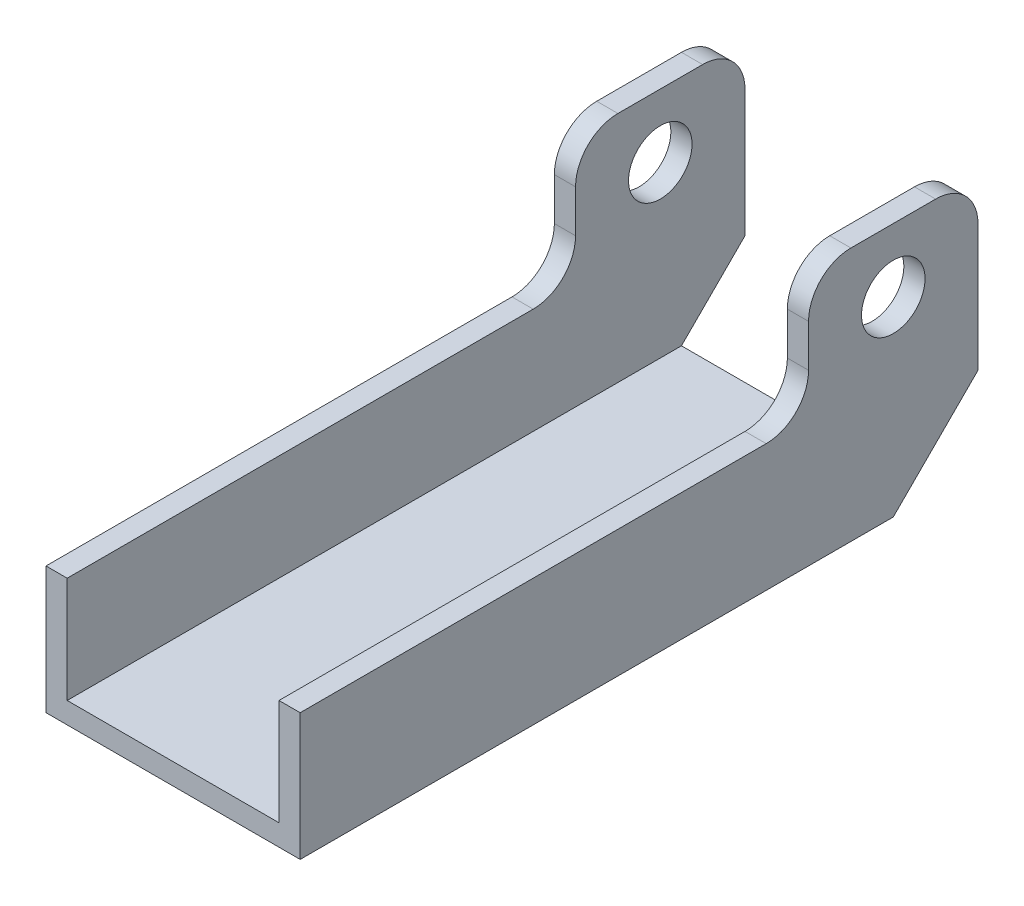
ISO-10303-21;
HEADER;
FILE_DESCRIPTION(('STEP AP214'),'2;1');
FILE_NAME('part.step','',(''),(''),'','','');
FILE_SCHEMA(('AUTOMOTIVE_DESIGN { 1 0 10303 214 1 1 1 1 }'));
ENDSEC;
DATA;
#1=APPLICATION_CONTEXT('core data for automotive mechanical design processes');
#2=APPLICATION_PROTOCOL_DEFINITION('international standard','automotive_design',2000,#1);
#3=PRODUCT_CONTEXT('',#1,'mechanical');
#4=PRODUCT('Part','Part','',(#3));
#5=PRODUCT_RELATED_PRODUCT_CATEGORY('part','',(#4));
#6=PRODUCT_DEFINITION_FORMATION('','',#4);
#7=PRODUCT_DEFINITION_CONTEXT('part definition',#1,'design');
#8=PRODUCT_DEFINITION('design','',#6,#7);
#9=PRODUCT_DEFINITION_SHAPE('','',#8);
#10=(LENGTH_UNIT() NAMED_UNIT(*) SI_UNIT(.MILLI.,.METRE.));
#11=(NAMED_UNIT(*) PLANE_ANGLE_UNIT() SI_UNIT($,.RADIAN.));
#12=(NAMED_UNIT(*) SI_UNIT($,.STERADIAN.) SOLID_ANGLE_UNIT());
#13=UNCERTAINTY_MEASURE_WITH_UNIT(LENGTH_MEASURE(1.E-05),#10,'distance_accuracy_value','');
#14=(GEOMETRIC_REPRESENTATION_CONTEXT(3) GLOBAL_UNCERTAINTY_ASSIGNED_CONTEXT((#13)) GLOBAL_UNIT_ASSIGNED_CONTEXT((#10,
#11,#12)) REPRESENTATION_CONTEXT('',''));
#15=CARTESIAN_POINT('',(0.,0.,0.));
#16=DIRECTION('',(0.,0.,1.));
#17=DIRECTION('',(1.,0.,0.));
#18=AXIS2_PLACEMENT_3D('',#15,#16,#17);
#19=CARTESIAN_POINT('',(0.,0.,0.));
#20=DIRECTION('',(0.,0.,-1.));
#21=DIRECTION('',(-1.,0.,0.));
#22=AXIS2_PLACEMENT_3D('',#19,#20,#21);
#23=PLANE('',#22);
#24=DIRECTION('',(0.,1.,0.));
#25=VECTOR('',#24,1.);
#26=CARTESIAN_POINT('',(19.05,9.525,0.));
#27=LINE('',#26,#25);
#28=CARTESIAN_POINT('',(19.05,6.35000000000005,0.));
#29=VERTEX_POINT('',#28);
#30=CARTESIAN_POINT('',(19.05,15.875,0.));
#31=VERTEX_POINT('',#30);
#32=EDGE_CURVE('E316',#29,#31,#27,.T.);
#33=ORIENTED_EDGE('',*,*,#32,.F.);
#34=DIRECTION('',(-1.,0.,0.));
#35=VECTOR('',#34,1.);
#36=CARTESIAN_POINT('',(0.,6.35000000000004,0.));
#37=LINE('',#36,#35);
#38=CARTESIAN_POINT('',(17.4625,6.35000000000004,0.));
#39=VERTEX_POINT('',#38);
#40=EDGE_CURVE('E276',#29,#39,#37,.T.);
#41=ORIENTED_EDGE('',*,*,#40,.T.);
#42=DIRECTION('',(0.,-1.,0.));
#43=VECTOR('',#42,1.);
#44=CARTESIAN_POINT('',(17.4625,9.525,0.));
#45=LINE('',#44,#43);
#46=CARTESIAN_POINT('',(17.4625,15.875,0.));
#47=VERTEX_POINT('',#46);
#48=EDGE_CURVE('E292',#47,#39,#45,.T.);
#49=ORIENTED_EDGE('',*,*,#48,.F.);
#50=DIRECTION('',(-1.,0.,0.));
#51=VECTOR('',#50,1.);
#52=CARTESIAN_POINT('',(0.,15.875,0.));
#53=LINE('',#52,#51);
#54=EDGE_CURVE('E254',#47,#31,#53,.F.);
#55=ORIENTED_EDGE('',*,*,#54,.T.);
#56=EDGE_LOOP('',(#33,#41,#49,#55));
#57=FACE_BOUND('',#56,.T.);
#58=ADVANCED_FACE('F39',(#57),#23,.T.);
#59=CARTESIAN_POINT('',(19.05,9.525,50.8));
#60=DIRECTION('',(-1.,0.,0.));
#61=DIRECTION('',(0.,0.,1.));
#62=AXIS2_PLACEMENT_3D('',#59,#60,#61);
#63=PLANE('',#62);
#64=DIRECTION('',(0.,0.,-1.));
#65=VECTOR('',#64,1.);
#66=CARTESIAN_POINT('',(19.05,0.,50.8));
#67=LINE('',#66,#65);
#68=CARTESIAN_POINT('',(19.05,0.,50.8));
#69=VERTEX_POINT('',#68);
#70=CARTESIAN_POINT('',(19.05,0.,6.35000000000011));
#71=VERTEX_POINT('',#70);
#72=EDGE_CURVE('E186',#69,#71,#67,.T.);
#73=ORIENTED_EDGE('',*,*,#72,.T.);
#74=DIRECTION('',(0.,0.707106781186544,-0.707106781186551));
#75=VECTOR('',#74,1.);
#76=CARTESIAN_POINT('',(19.05,0.,6.35000000000011));
#77=LINE('',#76,#75);
#78=EDGE_CURVE('E272',#71,#29,#77,.T.);
#79=ORIENTED_EDGE('',*,*,#78,.T.);
#80=ORIENTED_EDGE('',*,*,#32,.T.);
#81=CARTESIAN_POINT('',(19.05,15.875,3.175));
#82=DIRECTION('',(-1.,0.,0.));
#83=DIRECTION('',(0.,0.,1.));
#84=AXIS2_PLACEMENT_3D('',#81,#82,#83);
#85=CIRCLE('',#84,3.175);
#86=CARTESIAN_POINT('',(19.05,19.05,3.175));
#87=VERTEX_POINT('',#86);
#88=EDGE_CURVE('E243',#31,#87,#85,.F.);
#89=ORIENTED_EDGE('',*,*,#88,.T.);
#90=DIRECTION('',(0.,0.,-1.));
#91=VECTOR('',#90,1.);
#92=CARTESIAN_POINT('',(19.05,19.05,0.));
#93=LINE('',#92,#91);
#94=CARTESIAN_POINT('',(19.05,19.05,9.525));
#95=VERTEX_POINT('',#94);
#96=EDGE_CURVE('E354',#95,#87,#93,.T.);
#97=ORIENTED_EDGE('',*,*,#96,.F.);
#98=CARTESIAN_POINT('',(19.05,15.875,9.525));
#99=DIRECTION('',(-1.,0.,0.));
#100=DIRECTION('',(0.,0.,1.));
#101=AXIS2_PLACEMENT_3D('',#98,#99,#100);
#102=CIRCLE('',#101,3.175);
#103=CARTESIAN_POINT('',(19.05,15.875,12.7));
#104=VERTEX_POINT('',#103);
#105=EDGE_CURVE('E245',#95,#104,#102,.F.);
#106=ORIENTED_EDGE('',*,*,#105,.T.);
#107=DIRECTION('',(0.,-1.,0.));
#108=VECTOR('',#107,1.);
#109=CARTESIAN_POINT('',(19.05,19.05,12.7));
#110=LINE('',#109,#108);
#111=CARTESIAN_POINT('',(19.05,12.7,12.7));
#112=VERTEX_POINT('',#111);
#113=EDGE_CURVE('E349',#104,#112,#110,.T.);
#114=ORIENTED_EDGE('',*,*,#113,.T.);
#115=CARTESIAN_POINT('',(19.05,12.7,15.875));
#116=DIRECTION('',(-1.,0.,0.));
#117=DIRECTION('',(0.,0.,1.));
#118=AXIS2_PLACEMENT_3D('',#115,#116,#117);
#119=CIRCLE('',#118,3.175);
#120=CARTESIAN_POINT('',(19.05,9.525,15.875));
#121=VERTEX_POINT('',#120);
#122=EDGE_CURVE('E257',#112,#121,#119,.T.);
#123=ORIENTED_EDGE('',*,*,#122,.T.);
#124=DIRECTION('',(0.,0.,-1.));
#125=VECTOR('',#124,1.);
#126=CARTESIAN_POINT('',(19.05,9.525,50.8));
#127=LINE('',#126,#125);
#128=CARTESIAN_POINT('',(19.05,9.525,50.8));
#129=VERTEX_POINT('',#128);
#130=EDGE_CURVE('E208',#129,#121,#127,.T.);
#131=ORIENTED_EDGE('',*,*,#130,.F.);
#132=DIRECTION('',(0.,1.,0.));
#133=VECTOR('',#132,1.);
#134=CARTESIAN_POINT('',(19.05,9.525,50.8));
#135=LINE('',#134,#133);
#136=EDGE_CURVE('E189',#69,#129,#135,.T.);
#137=ORIENTED_EDGE('',*,*,#136,.F.);
#138=EDGE_LOOP('',(#73,#79,#80,#89,#97,#106,#114,#123,#131,#137));
#139=FACE_BOUND('',#138,.T.);
#140=CARTESIAN_POINT('',(19.05,14.2875,6.35));
#141=DIRECTION('',(1.,0.,0.));
#142=DIRECTION('',(0.,0.,-1.));
#143=AXIS2_PLACEMENT_3D('',#140,#141,#142);
#144=CIRCLE('',#143,2.38125);
#145=CARTESIAN_POINT('',(19.05,14.2875,3.96875));
#146=VERTEX_POINT('',#145);
#147=EDGE_CURVE('E435',#146,#146,#144,.T.);
#148=ORIENTED_EDGE('',*,*,#147,.F.);
#149=EDGE_LOOP('',(#148));
#150=FACE_BOUND('',#149,.T.);
#151=ADVANCED_FACE('F296',(#139,#150),#63,.F.);
#152=CARTESIAN_POINT('',(17.4625,9.525,50.8));
#153=DIRECTION('',(0.,-1.,0.));
#154=DIRECTION('',(0.,0.,-1.));
#155=AXIS2_PLACEMENT_3D('',#152,#153,#154);
#156=PLANE('',#155);
#157=ORIENTED_EDGE('',*,*,#130,.T.);
#158=DIRECTION('',(1.,0.,0.));
#159=VECTOR('',#158,1.);
#160=CARTESIAN_POINT('',(17.4625,9.525,15.875));
#161=LINE('',#160,#159);
#162=CARTESIAN_POINT('',(17.4625,9.525,15.875));
#163=VERTEX_POINT('',#162);
#164=EDGE_CURVE('E214',#121,#163,#161,.F.);
#165=ORIENTED_EDGE('',*,*,#164,.T.);
#166=DIRECTION('',(0.,0.,-1.));
#167=VECTOR('',#166,1.);
#168=CARTESIAN_POINT('',(17.4625,9.525,50.8));
#169=LINE('',#168,#167);
#170=CARTESIAN_POINT('',(17.4625,9.525,50.8));
#171=VERTEX_POINT('',#170);
#172=EDGE_CURVE('E327',#171,#163,#169,.T.);
#173=ORIENTED_EDGE('',*,*,#172,.F.);
#174=DIRECTION('',(-1.,0.,0.));
#175=VECTOR('',#174,1.);
#176=CARTESIAN_POINT('',(17.4625,9.525,50.8));
#177=LINE('',#176,#175);
#178=EDGE_CURVE('E302',#129,#171,#177,.T.);
#179=ORIENTED_EDGE('',*,*,#178,.F.);
#180=EDGE_LOOP('',(#157,#165,#173,#179));
#181=FACE_BOUND('',#180,.T.);
#182=ADVANCED_FACE('F331',(#181),#156,.F.);
#183=CARTESIAN_POINT('',(0.,9.525,50.8));
#184=DIRECTION('',(0.,-1.,0.));
#185=DIRECTION('',(0.,0.,-1.));
#186=AXIS2_PLACEMENT_3D('',#183,#184,#185);
#187=PLANE('',#186);
#188=DIRECTION('',(0.,0.,-1.));
#189=VECTOR('',#188,1.);
#190=CARTESIAN_POINT('',(1.5875,9.525,50.8));
#191=LINE('',#190,#189);
#192=CARTESIAN_POINT('',(1.5875,9.525,50.8));
#193=VERTEX_POINT('',#192);
#194=CARTESIAN_POINT('',(1.5875,9.525,15.875));
#195=VERTEX_POINT('',#194);
#196=EDGE_CURVE('E321',#193,#195,#191,.T.);
#197=ORIENTED_EDGE('',*,*,#196,.T.);
#198=DIRECTION('',(1.,0.,0.));
#199=VECTOR('',#198,1.);
#200=CARTESIAN_POINT('',(0.,9.525,15.875));
#201=LINE('',#200,#199);
#202=CARTESIAN_POINT('',(0.,9.525,15.875));
#203=VERTEX_POINT('',#202);
#204=EDGE_CURVE('E221',#195,#203,#201,.F.);
#205=ORIENTED_EDGE('',*,*,#204,.T.);
#206=DIRECTION('',(0.,0.,-1.));
#207=VECTOR('',#206,1.);
#208=CARTESIAN_POINT('',(0.,9.525,50.8));
#209=LINE('',#208,#207);
#210=CARTESIAN_POINT('',(0.,9.525,50.8));
#211=VERTEX_POINT('',#210);
#212=EDGE_CURVE('E313',#211,#203,#209,.T.);
#213=ORIENTED_EDGE('',*,*,#212,.F.);
#214=DIRECTION('',(-1.,0.,0.));
#215=VECTOR('',#214,1.);
#216=CARTESIAN_POINT('',(0.,9.525,50.8));
#217=LINE('',#216,#215);
#218=EDGE_CURVE('E195',#193,#211,#217,.T.);
#219=ORIENTED_EDGE('',*,*,#218,.F.);
#220=EDGE_LOOP('',(#197,#205,#213,#219));
#221=FACE_BOUND('',#220,.T.);
#222=ADVANCED_FACE('F377',(#221),#187,.F.);
#223=CARTESIAN_POINT('',(0.,0.,50.8));
#224=DIRECTION('',(1.,0.,0.));
#225=DIRECTION('',(0.,0.,-1.));
#226=AXIS2_PLACEMENT_3D('',#223,#224,#225);
#227=PLANE('',#226);
#228=CARTESIAN_POINT('',(0.,14.2875,6.35));
#229=DIRECTION('',(1.,0.,0.));
#230=DIRECTION('',(0.,0.,-1.));
#231=AXIS2_PLACEMENT_3D('',#228,#229,#230);
#232=CIRCLE('',#231,2.38124999999999);
#233=CARTESIAN_POINT('',(0.,14.2875,3.96875000000001));
#234=VERTEX_POINT('',#233);
#235=EDGE_CURVE('E270',#234,#234,#232,.T.);
#236=ORIENTED_EDGE('',*,*,#235,.T.);
#237=EDGE_LOOP('',(#236));
#238=FACE_BOUND('',#237,.T.);
#239=DIRECTION('',(0.,-1.,0.));
#240=VECTOR('',#239,1.);
#241=CARTESIAN_POINT('',(0.,0.,0.));
#242=LINE('',#241,#240);
#243=CARTESIAN_POINT('',(0.,15.875,0.));
#244=VERTEX_POINT('',#243);
#245=CARTESIAN_POINT('',(0.,6.35000000000004,0.));
#246=VERTEX_POINT('',#245);
#247=EDGE_CURVE('E314',#244,#246,#242,.T.);
#248=ORIENTED_EDGE('',*,*,#247,.T.);
#249=DIRECTION('',(0.,-0.707106781186544,0.707106781186551));
#250=VECTOR('',#249,1.);
#251=CARTESIAN_POINT('',(0.,0.,6.35000000000011));
#252=LINE('',#251,#250);
#253=CARTESIAN_POINT('',(0.,0.,6.35000000000011));
#254=VERTEX_POINT('',#253);
#255=EDGE_CURVE('E11',#246,#254,#252,.T.);
#256=ORIENTED_EDGE('',*,*,#255,.T.);
#257=DIRECTION('',(0.,0.,-1.));
#258=VECTOR('',#257,1.);
#259=CARTESIAN_POINT('',(0.,0.,50.8));
#260=LINE('',#259,#258);
#261=CARTESIAN_POINT('',(0.,0.,50.8));
#262=VERTEX_POINT('',#261);
#263=EDGE_CURVE('E183',#262,#254,#260,.T.);
#264=ORIENTED_EDGE('',*,*,#263,.F.);
#265=DIRECTION('',(0.,-1.,0.));
#266=VECTOR('',#265,1.);
#267=CARTESIAN_POINT('',(0.,0.,50.8));
#268=LINE('',#267,#266);
#269=EDGE_CURVE('E190',#211,#262,#268,.T.);
#270=ORIENTED_EDGE('',*,*,#269,.F.);
#271=ORIENTED_EDGE('',*,*,#212,.T.);
#272=CARTESIAN_POINT('',(0.,12.7,15.875));
#273=DIRECTION('',(1.,0.,0.));
#274=DIRECTION('',(0.,0.,-1.));
#275=AXIS2_PLACEMENT_3D('',#272,#273,#274);
#276=CIRCLE('',#275,3.175);
#277=CARTESIAN_POINT('',(0.,12.7,12.7));
#278=VERTEX_POINT('',#277);
#279=EDGE_CURVE('E263',#203,#278,#276,.T.);
#280=ORIENTED_EDGE('',*,*,#279,.T.);
#281=DIRECTION('',(0.,-1.,0.));
#282=VECTOR('',#281,1.);
#283=CARTESIAN_POINT('',(0.,19.05,12.7));
#284=LINE('',#283,#282);
#285=CARTESIAN_POINT('',(0.,15.875,12.7));
#286=VERTEX_POINT('',#285);
#287=EDGE_CURVE('E317',#286,#278,#284,.T.);
#288=ORIENTED_EDGE('',*,*,#287,.F.);
#289=CARTESIAN_POINT('',(0.,15.875,9.525));
#290=DIRECTION('',(1.,0.,0.));
#291=DIRECTION('',(0.,0.,-1.));
#292=AXIS2_PLACEMENT_3D('',#289,#290,#291);
#293=CIRCLE('',#292,3.175);
#294=CARTESIAN_POINT('',(0.,19.05,9.525));
#295=VERTEX_POINT('',#294);
#296=EDGE_CURVE('E235',#286,#295,#293,.F.);
#297=ORIENTED_EDGE('',*,*,#296,.T.);
#298=DIRECTION('',(0.,0.,1.));
#299=VECTOR('',#298,1.);
#300=CARTESIAN_POINT('',(0.,19.05,0.));
#301=LINE('',#300,#299);
#302=CARTESIAN_POINT('',(0.,19.05,3.175));
#303=VERTEX_POINT('',#302);
#304=EDGE_CURVE('E348',#303,#295,#301,.T.);
#305=ORIENTED_EDGE('',*,*,#304,.F.);
#306=CARTESIAN_POINT('',(0.,15.875,3.175));
#307=DIRECTION('',(1.,0.,0.));
#308=DIRECTION('',(0.,0.,-1.));
#309=AXIS2_PLACEMENT_3D('',#306,#307,#308);
#310=CIRCLE('',#309,3.175);
#311=EDGE_CURVE('E233',#303,#244,#310,.F.);
#312=ORIENTED_EDGE('',*,*,#311,.T.);
#313=EDGE_LOOP('',(#248,#256,#264,#270,#271,#280,#288,#297,#305,#312));
#314=FACE_BOUND('',#313,.T.);
#315=ADVANCED_FACE('F202',(#238,#314),#227,.F.);
#316=CARTESIAN_POINT('',(0.,0.,50.8));
#317=DIRECTION('',(0.,1.,0.));
#318=DIRECTION('',(-1.,0.,0.));
#319=AXIS2_PLACEMENT_3D('',#316,#317,#318);
#320=PLANE('',#319);
#321=ORIENTED_EDGE('',*,*,#263,.T.);
#322=DIRECTION('',(1.,0.,0.));
#323=VECTOR('',#322,1.);
#324=CARTESIAN_POINT('',(19.05,0.,6.35000000000011));
#325=LINE('',#324,#323);
#326=EDGE_CURVE('E265',#254,#71,#325,.T.);
#327=ORIENTED_EDGE('',*,*,#326,.T.);
#328=ORIENTED_EDGE('',*,*,#72,.F.);
#329=DIRECTION('',(1.,0.,0.));
#330=VECTOR('',#329,1.);
#331=CARTESIAN_POINT('',(0.,0.,50.8));
#332=LINE('',#331,#330);
#333=EDGE_CURVE('E178',#262,#69,#332,.T.);
#334=ORIENTED_EDGE('',*,*,#333,.F.);
#335=EDGE_LOOP('',(#321,#327,#328,#334));
#336=FACE_BOUND('',#335,.T.);
#337=ADVANCED_FACE('F180',(#336),#320,.F.);
#338=CARTESIAN_POINT('',(17.4625,9.525,50.8));
#339=DIRECTION('',(1.,0.,0.));
#340=DIRECTION('',(0.,0.,-1.));
#341=AXIS2_PLACEMENT_3D('',#338,#339,#340);
#342=PLANE('',#341);
#343=CARTESIAN_POINT('',(17.4625,14.2875,6.35));
#344=DIRECTION('',(1.,0.,0.));
#345=DIRECTION('',(0.,0.,-1.));
#346=AXIS2_PLACEMENT_3D('',#343,#344,#345);
#347=CIRCLE('',#346,2.38125);
#348=CARTESIAN_POINT('',(17.4625,14.2875,3.96875));
#349=VERTEX_POINT('',#348);
#350=EDGE_CURVE('E269',#349,#349,#347,.T.);
#351=ORIENTED_EDGE('',*,*,#350,.T.);
#352=EDGE_LOOP('',(#351));
#353=FACE_BOUND('',#352,.T.);
#354=ORIENTED_EDGE('',*,*,#48,.T.);
#355=DIRECTION('',(0.,-0.707106781186544,0.707106781186551));
#356=VECTOR('',#355,1.);
#357=CARTESIAN_POINT('',(17.4625,0.,6.35000000000011));
#358=LINE('',#357,#356);
#359=CARTESIAN_POINT('',(17.4625,1.5875,4.76250000000009));
#360=VERTEX_POINT('',#359);
#361=EDGE_CURVE('E62',#39,#360,#358,.T.);
#362=ORIENTED_EDGE('',*,*,#361,.T.);
#363=DIRECTION('',(0.,0.,-1.));
#364=VECTOR('',#363,1.);
#365=CARTESIAN_POINT('',(17.4625,1.5875,50.8));
#366=LINE('',#365,#364);
#367=CARTESIAN_POINT('',(17.4625,1.5875,50.8));
#368=VERTEX_POINT('',#367);
#369=EDGE_CURVE('E325',#368,#360,#366,.T.);
#370=ORIENTED_EDGE('',*,*,#369,.F.);
#371=DIRECTION('',(0.,-1.,0.));
#372=VECTOR('',#371,1.);
#373=CARTESIAN_POINT('',(17.4625,9.525,50.8));
#374=LINE('',#373,#372);
#375=EDGE_CURVE('E304',#171,#368,#374,.T.);
#376=ORIENTED_EDGE('',*,*,#375,.F.);
#377=ORIENTED_EDGE('',*,*,#172,.T.);
#378=CARTESIAN_POINT('',(17.4625,12.7,15.875));
#379=DIRECTION('',(1.,0.,0.));
#380=DIRECTION('',(0.,0.,-1.));
#381=AXIS2_PLACEMENT_3D('',#378,#379,#380);
#382=CIRCLE('',#381,3.175);
#383=CARTESIAN_POINT('',(17.4625,12.7,12.7));
#384=VERTEX_POINT('',#383);
#385=EDGE_CURVE('E259',#163,#384,#382,.T.);
#386=ORIENTED_EDGE('',*,*,#385,.T.);
#387=DIRECTION('',(0.,-1.,0.));
#388=VECTOR('',#387,1.);
#389=CARTESIAN_POINT('',(17.4625,19.05,12.7));
#390=LINE('',#389,#388);
#391=CARTESIAN_POINT('',(17.4625,15.875,12.7));
#392=VERTEX_POINT('',#391);
#393=EDGE_CURVE('E340',#392,#384,#390,.T.);
#394=ORIENTED_EDGE('',*,*,#393,.F.);
#395=CARTESIAN_POINT('',(17.4625,15.875,9.525));
#396=DIRECTION('',(1.,0.,0.));
#397=DIRECTION('',(0.,0.,-1.));
#398=AXIS2_PLACEMENT_3D('',#395,#396,#397);
#399=CIRCLE('',#398,3.175);
#400=CARTESIAN_POINT('',(17.4625,19.05,9.525));
#401=VERTEX_POINT('',#400);
#402=EDGE_CURVE('E249',#392,#401,#399,.F.);
#403=ORIENTED_EDGE('',*,*,#402,.T.);
#404=DIRECTION('',(0.,0.,1.));
#405=VECTOR('',#404,1.);
#406=CARTESIAN_POINT('',(17.4625,19.05,0.));
#407=LINE('',#406,#405);
#408=CARTESIAN_POINT('',(17.4625,19.05,3.175));
#409=VERTEX_POINT('',#408);
#410=EDGE_CURVE('E439',#409,#401,#407,.T.);
#411=ORIENTED_EDGE('',*,*,#410,.F.);
#412=CARTESIAN_POINT('',(17.4625,15.875,3.175));
#413=DIRECTION('',(1.,0.,0.));
#414=DIRECTION('',(0.,0.,-1.));
#415=AXIS2_PLACEMENT_3D('',#412,#413,#414);
#416=CIRCLE('',#415,3.175);
#417=EDGE_CURVE('E247',#409,#47,#416,.F.);
#418=ORIENTED_EDGE('',*,*,#417,.T.);
#419=EDGE_LOOP('',(#354,#362,#370,#376,#377,#386,#394,#403,#411,#418));
#420=FACE_BOUND('',#419,.T.);
#421=ADVANCED_FACE('F339',(#353,#420),#342,.F.);
#422=CARTESIAN_POINT('',(17.4625,1.5875,50.8));
#423=DIRECTION('',(0.,-1.,0.));
#424=DIRECTION('',(1.,0.,0.));
#425=AXIS2_PLACEMENT_3D('',#422,#423,#424);
#426=PLANE('',#425);
#427=ORIENTED_EDGE('',*,*,#369,.T.);
#428=DIRECTION('',(-1.,0.,0.));
#429=VECTOR('',#428,1.);
#430=CARTESIAN_POINT('',(0.,1.5875,4.7625000000001));
#431=LINE('',#430,#429);
#432=CARTESIAN_POINT('',(1.5875,1.5875,4.7625000000001));
#433=VERTEX_POINT('',#432);
#434=EDGE_CURVE('E54',#360,#433,#431,.T.);
#435=ORIENTED_EDGE('',*,*,#434,.T.);
#436=DIRECTION('',(0.,0.,-1.));
#437=VECTOR('',#436,1.);
#438=CARTESIAN_POINT('',(1.5875,1.5875,50.8));
#439=LINE('',#438,#437);
#440=CARTESIAN_POINT('',(1.5875,1.5875,50.8));
#441=VERTEX_POINT('',#440);
#442=EDGE_CURVE('E284',#441,#433,#439,.T.);
#443=ORIENTED_EDGE('',*,*,#442,.F.);
#444=DIRECTION('',(-1.,0.,0.));
#445=VECTOR('',#444,1.);
#446=CARTESIAN_POINT('',(17.4625,1.5875,50.8));
#447=LINE('',#446,#445);
#448=EDGE_CURVE('E308',#368,#441,#447,.T.);
#449=ORIENTED_EDGE('',*,*,#448,.F.);
#450=EDGE_LOOP('',(#427,#435,#443,#449));
#451=FACE_BOUND('',#450,.T.);
#452=ADVANCED_FACE('F410',(#451),#426,.F.);
#453=CARTESIAN_POINT('',(1.5875,1.5875,50.8));
#454=DIRECTION('',(-1.,0.,0.));
#455=DIRECTION('',(0.,-1.,0.));
#456=AXIS2_PLACEMENT_3D('',#453,#454,#455);
#457=PLANE('',#456);
#458=CARTESIAN_POINT('',(1.5875,14.2875,6.35));
#459=DIRECTION('',(-1.,0.,0.));
#460=DIRECTION('',(0.,-1.,0.));
#461=AXIS2_PLACEMENT_3D('',#458,#459,#460);
#462=CIRCLE('',#461,2.38125);
#463=CARTESIAN_POINT('',(1.5875,11.90625,6.35));
#464=VERTEX_POINT('',#463);
#465=EDGE_CURVE('E266',#464,#464,#462,.T.);
#466=ORIENTED_EDGE('',*,*,#465,.T.);
#467=EDGE_LOOP('',(#466));
#468=FACE_BOUND('',#467,.T.);
#469=ORIENTED_EDGE('',*,*,#442,.T.);
#470=DIRECTION('',(0.,0.707106781186544,-0.707106781186551));
#471=VECTOR('',#470,1.);
#472=CARTESIAN_POINT('',(1.5875,0.,6.35000000000011));
#473=LINE('',#472,#471);
#474=CARTESIAN_POINT('',(1.5875,6.35000000000004,0.));
#475=VERTEX_POINT('',#474);
#476=EDGE_CURVE('E47',#433,#475,#473,.T.);
#477=ORIENTED_EDGE('',*,*,#476,.T.);
#478=DIRECTION('',(0.,1.,0.));
#479=VECTOR('',#478,1.);
#480=CARTESIAN_POINT('',(1.5875,1.5875,0.));
#481=LINE('',#480,#479);
#482=CARTESIAN_POINT('',(1.5875,15.875,0.));
#483=VERTEX_POINT('',#482);
#484=EDGE_CURVE('E199',#475,#483,#481,.T.);
#485=ORIENTED_EDGE('',*,*,#484,.T.);
#486=CARTESIAN_POINT('',(1.5875,15.875,3.175));
#487=DIRECTION('',(-1.,0.,0.));
#488=DIRECTION('',(0.,-1.,0.));
#489=AXIS2_PLACEMENT_3D('',#486,#487,#488);
#490=CIRCLE('',#489,3.175);
#491=CARTESIAN_POINT('',(1.5875,19.05,3.175));
#492=VERTEX_POINT('',#491);
#493=EDGE_CURVE('E229',#483,#492,#490,.F.);
#494=ORIENTED_EDGE('',*,*,#493,.T.);
#495=DIRECTION('',(0.,0.,-1.));
#496=VECTOR('',#495,1.);
#497=CARTESIAN_POINT('',(1.5875,19.05,0.));
#498=LINE('',#497,#496);
#499=CARTESIAN_POINT('',(1.5875,19.05,9.525));
#500=VERTEX_POINT('',#499);
#501=EDGE_CURVE('E352',#500,#492,#498,.T.);
#502=ORIENTED_EDGE('',*,*,#501,.F.);
#503=CARTESIAN_POINT('',(1.5875,15.875,9.525));
#504=DIRECTION('',(-1.,0.,0.));
#505=DIRECTION('',(0.,-1.,0.));
#506=AXIS2_PLACEMENT_3D('',#503,#504,#505);
#507=CIRCLE('',#506,3.175);
#508=CARTESIAN_POINT('',(1.5875,15.875,12.7));
#509=VERTEX_POINT('',#508);
#510=EDGE_CURVE('E231',#500,#509,#507,.F.);
#511=ORIENTED_EDGE('',*,*,#510,.T.);
#512=DIRECTION('',(0.,-1.,0.));
#513=VECTOR('',#512,1.);
#514=CARTESIAN_POINT('',(1.5875,19.05,12.7));
#515=LINE('',#514,#513);
#516=CARTESIAN_POINT('',(1.5875,12.7,12.7));
#517=VERTEX_POINT('',#516);
#518=EDGE_CURVE('E360',#509,#517,#515,.T.);
#519=ORIENTED_EDGE('',*,*,#518,.T.);
#520=CARTESIAN_POINT('',(1.5875,12.7,15.875));
#521=DIRECTION('',(-1.,0.,0.));
#522=DIRECTION('',(0.,-1.,0.));
#523=AXIS2_PLACEMENT_3D('',#520,#521,#522);
#524=CIRCLE('',#523,3.175);
#525=EDGE_CURVE('E261',#517,#195,#524,.T.);
#526=ORIENTED_EDGE('',*,*,#525,.T.);
#527=ORIENTED_EDGE('',*,*,#196,.F.);
#528=DIRECTION('',(0.,1.,0.));
#529=VECTOR('',#528,1.);
#530=CARTESIAN_POINT('',(1.5875,1.5875,50.8));
#531=LINE('',#530,#529);
#532=EDGE_CURVE('E310',#441,#193,#531,.T.);
#533=ORIENTED_EDGE('',*,*,#532,.F.);
#534=EDGE_LOOP('',(#469,#477,#485,#494,#502,#511,#519,#526,#527,#533));
#535=FACE_BOUND('',#534,.T.);
#536=ADVANCED_FACE('F282',(#468,#535),#457,.F.);
#537=CARTESIAN_POINT('',(0.,0.,50.8));
#538=DIRECTION('',(0.,0.,-1.));
#539=DIRECTION('',(-1.,0.,0.));
#540=AXIS2_PLACEMENT_3D('',#537,#538,#539);
#541=PLANE('',#540);
#542=ORIENTED_EDGE('',*,*,#269,.T.);
#543=ORIENTED_EDGE('',*,*,#333,.T.);
#544=ORIENTED_EDGE('',*,*,#136,.T.);
#545=ORIENTED_EDGE('',*,*,#178,.T.);
#546=ORIENTED_EDGE('',*,*,#375,.T.);
#547=ORIENTED_EDGE('',*,*,#448,.T.);
#548=ORIENTED_EDGE('',*,*,#532,.T.);
#549=ORIENTED_EDGE('',*,*,#218,.T.);
#550=EDGE_LOOP('',(#542,#543,#544,#545,#546,#547,#548,#549));
#551=FACE_BOUND('',#550,.T.);
#552=ADVANCED_FACE('F193',(#551),#541,.F.);
#553=ORIENTED_EDGE('',*,*,#484,.F.);
#554=DIRECTION('',(-1.,0.,0.));
#555=VECTOR('',#554,1.);
#556=CARTESIAN_POINT('',(0.,6.35000000000004,0.));
#557=LINE('',#556,#555);
#558=EDGE_CURVE('E274',#475,#246,#557,.T.);
#559=ORIENTED_EDGE('',*,*,#558,.T.);
#560=ORIENTED_EDGE('',*,*,#247,.F.);
#561=DIRECTION('',(-1.,0.,0.));
#562=VECTOR('',#561,1.);
#563=CARTESIAN_POINT('',(0.,15.875,0.));
#564=LINE('',#563,#562);
#565=EDGE_CURVE('E251',#244,#483,#564,.F.);
#566=ORIENTED_EDGE('',*,*,#565,.T.);
#567=EDGE_LOOP('',(#553,#559,#560,#566));
#568=FACE_BOUND('',#567,.T.);
#569=ADVANCED_FACE('F288',(#568),#23,.T.);
#570=CARTESIAN_POINT('',(0.,19.05,12.7));
#571=DIRECTION('',(0.,0.,-1.));
#572=DIRECTION('',(-1.,0.,0.));
#573=AXIS2_PLACEMENT_3D('',#570,#571,#572);
#574=PLANE('',#573);
#575=ORIENTED_EDGE('',*,*,#287,.T.);
#576=DIRECTION('',(1.,0.,0.));
#577=VECTOR('',#576,1.);
#578=CARTESIAN_POINT('',(1.5875,12.7,12.7));
#579=LINE('',#578,#577);
#580=EDGE_CURVE('E218',#278,#517,#579,.T.);
#581=ORIENTED_EDGE('',*,*,#580,.T.);
#582=ORIENTED_EDGE('',*,*,#518,.F.);
#583=DIRECTION('',(1.,0.,0.));
#584=VECTOR('',#583,1.);
#585=CARTESIAN_POINT('',(0.,15.875,12.7));
#586=LINE('',#585,#584);
#587=EDGE_CURVE('E216',#509,#286,#586,.F.);
#588=ORIENTED_EDGE('',*,*,#587,.T.);
#589=EDGE_LOOP('',(#575,#581,#582,#588));
#590=FACE_BOUND('',#589,.T.);
#591=ADVANCED_FACE('F367',(#590),#574,.F.);
#592=CARTESIAN_POINT('',(0.,19.05,0.));
#593=DIRECTION('',(0.,1.,0.));
#594=DIRECTION('',(0.,0.,1.));
#595=AXIS2_PLACEMENT_3D('',#592,#593,#594);
#596=PLANE('',#595);
#597=ORIENTED_EDGE('',*,*,#304,.T.);
#598=DIRECTION('',(1.,0.,0.));
#599=VECTOR('',#598,1.);
#600=CARTESIAN_POINT('',(1.58750000000001,19.05,9.525));
#601=LINE('',#600,#599);
#602=EDGE_CURVE('E226',#295,#500,#601,.T.);
#603=ORIENTED_EDGE('',*,*,#602,.T.);
#604=ORIENTED_EDGE('',*,*,#501,.T.);
#605=DIRECTION('',(-1.,0.,0.));
#606=VECTOR('',#605,1.);
#607=CARTESIAN_POINT('',(0.,19.05,3.175));
#608=LINE('',#607,#606);
#609=EDGE_CURVE('E223',#492,#303,#608,.T.);
#610=ORIENTED_EDGE('',*,*,#609,.T.);
#611=EDGE_LOOP('',(#597,#603,#604,#610));
#612=FACE_BOUND('',#611,.T.);
#613=ADVANCED_FACE('F404',(#612),#596,.T.);
#614=CARTESIAN_POINT('',(17.4625,19.05,12.7));
#615=DIRECTION('',(0.,0.,-1.));
#616=DIRECTION('',(-1.,0.,0.));
#617=AXIS2_PLACEMENT_3D('',#614,#615,#616);
#618=PLANE('',#617);
#619=ORIENTED_EDGE('',*,*,#393,.T.);
#620=DIRECTION('',(1.,0.,0.));
#621=VECTOR('',#620,1.);
#622=CARTESIAN_POINT('',(19.05,12.7,12.7));
#623=LINE('',#622,#621);
#624=EDGE_CURVE('E206',#384,#112,#623,.T.);
#625=ORIENTED_EDGE('',*,*,#624,.T.);
#626=ORIENTED_EDGE('',*,*,#113,.F.);
#627=DIRECTION('',(1.,0.,0.));
#628=VECTOR('',#627,1.);
#629=CARTESIAN_POINT('',(17.4625,15.875,12.7));
#630=LINE('',#629,#628);
#631=EDGE_CURVE('E204',#104,#392,#630,.F.);
#632=ORIENTED_EDGE('',*,*,#631,.T.);
#633=EDGE_LOOP('',(#619,#625,#626,#632));
#634=FACE_BOUND('',#633,.T.);
#635=ADVANCED_FACE('F344',(#634),#618,.F.);
#636=CARTESIAN_POINT('',(0.,19.05,0.));
#637=DIRECTION('',(0.,1.,0.));
#638=DIRECTION('',(0.,0.,1.));
#639=AXIS2_PLACEMENT_3D('',#636,#637,#638);
#640=PLANE('',#639);
#641=ORIENTED_EDGE('',*,*,#410,.T.);
#642=DIRECTION('',(1.,0.,0.));
#643=VECTOR('',#642,1.);
#644=CARTESIAN_POINT('',(19.05,19.05,9.525));
#645=LINE('',#644,#643);
#646=EDGE_CURVE('E240',#401,#95,#645,.T.);
#647=ORIENTED_EDGE('',*,*,#646,.T.);
#648=ORIENTED_EDGE('',*,*,#96,.T.);
#649=DIRECTION('',(-1.,0.,0.));
#650=VECTOR('',#649,1.);
#651=CARTESIAN_POINT('',(0.,19.05,3.175));
#652=LINE('',#651,#650);
#653=EDGE_CURVE('E237',#87,#409,#652,.T.);
#654=ORIENTED_EDGE('',*,*,#653,.T.);
#655=EDGE_LOOP('',(#641,#647,#648,#654));
#656=FACE_BOUND('',#655,.T.);
#657=ADVANCED_FACE('F418',(#656),#640,.T.);
#658=CARTESIAN_POINT('',(17.4625,12.7,15.875));
#659=DIRECTION('',(-1.,0.,0.));
#660=DIRECTION('',(0.,0.,1.));
#661=AXIS2_PLACEMENT_3D('',#658,#659,#660);
#662=CYLINDRICAL_SURFACE('',#661,3.175);
#663=ORIENTED_EDGE('',*,*,#385,.F.);
#664=ORIENTED_EDGE('',*,*,#164,.F.);
#665=ORIENTED_EDGE('',*,*,#122,.F.);
#666=ORIENTED_EDGE('',*,*,#624,.F.);
#667=EDGE_LOOP('',(#663,#664,#665,#666));
#668=FACE_BOUND('',#667,.T.);
#669=ADVANCED_FACE('F335',(#668),#662,.F.);
#670=CARTESIAN_POINT('',(0.,12.7,15.875));
#671=DIRECTION('',(-1.,0.,0.));
#672=DIRECTION('',(0.,0.,1.));
#673=AXIS2_PLACEMENT_3D('',#670,#671,#672);
#674=CYLINDRICAL_SURFACE('',#673,3.175);
#675=ORIENTED_EDGE('',*,*,#279,.F.);
#676=ORIENTED_EDGE('',*,*,#204,.F.);
#677=ORIENTED_EDGE('',*,*,#525,.F.);
#678=ORIENTED_EDGE('',*,*,#580,.F.);
#679=EDGE_LOOP('',(#675,#676,#677,#678));
#680=FACE_BOUND('',#679,.T.);
#681=ADVANCED_FACE('F373',(#680),#674,.F.);
#682=CARTESIAN_POINT('',(0.,15.875,9.525));
#683=DIRECTION('',(-1.,0.,0.));
#684=DIRECTION('',(0.,0.,1.));
#685=AXIS2_PLACEMENT_3D('',#682,#683,#684);
#686=CYLINDRICAL_SURFACE('',#685,3.175);
#687=ORIENTED_EDGE('',*,*,#296,.F.);
#688=ORIENTED_EDGE('',*,*,#587,.F.);
#689=ORIENTED_EDGE('',*,*,#510,.F.);
#690=ORIENTED_EDGE('',*,*,#602,.F.);
#691=EDGE_LOOP('',(#687,#688,#689,#690));
#692=FACE_BOUND('',#691,.T.);
#693=ADVANCED_FACE('F458',(#692),#686,.T.);
#694=CARTESIAN_POINT('',(0.,15.875,9.52499999999996));
#695=DIRECTION('',(-1.,0.,0.));
#696=DIRECTION('',(0.,0.,1.));
#697=AXIS2_PLACEMENT_3D('',#694,#695,#696);
#698=CYLINDRICAL_SURFACE('',#697,3.175);
#699=ORIENTED_EDGE('',*,*,#402,.F.);
#700=ORIENTED_EDGE('',*,*,#631,.F.);
#701=ORIENTED_EDGE('',*,*,#105,.F.);
#702=ORIENTED_EDGE('',*,*,#646,.F.);
#703=EDGE_LOOP('',(#699,#700,#701,#702));
#704=FACE_BOUND('',#703,.T.);
#705=ADVANCED_FACE('F456',(#704),#698,.T.);
#706=CARTESIAN_POINT('',(0.,15.875,3.175));
#707=DIRECTION('',(-1.,0.,0.));
#708=DIRECTION('',(0.,0.,1.));
#709=AXIS2_PLACEMENT_3D('',#706,#707,#708);
#710=CYLINDRICAL_SURFACE('',#709,3.175);
#711=ORIENTED_EDGE('',*,*,#88,.F.);
#712=ORIENTED_EDGE('',*,*,#54,.F.);
#713=ORIENTED_EDGE('',*,*,#417,.F.);
#714=ORIENTED_EDGE('',*,*,#653,.F.);
#715=EDGE_LOOP('',(#711,#712,#713,#714));
#716=FACE_BOUND('',#715,.T.);
#717=ADVANCED_FACE('F452',(#716),#710,.T.);
#718=CARTESIAN_POINT('',(0.,15.875,3.175));
#719=DIRECTION('',(-1.,0.,0.));
#720=DIRECTION('',(0.,0.,1.));
#721=AXIS2_PLACEMENT_3D('',#718,#719,#720);
#722=CYLINDRICAL_SURFACE('',#721,3.175);
#723=ORIENTED_EDGE('',*,*,#493,.F.);
#724=ORIENTED_EDGE('',*,*,#565,.F.);
#725=ORIENTED_EDGE('',*,*,#311,.F.);
#726=ORIENTED_EDGE('',*,*,#609,.F.);
#727=EDGE_LOOP('',(#723,#724,#725,#726));
#728=FACE_BOUND('',#727,.T.);
#729=ADVANCED_FACE('F430',(#728),#722,.T.);
#730=CARTESIAN_POINT('',(19.05,14.2875,6.35));
#731=DIRECTION('',(1.,0.,0.));
#732=DIRECTION('',(0.,0.,-1.));
#733=AXIS2_PLACEMENT_3D('',#730,#731,#732);
#734=CYLINDRICAL_SURFACE('',#733,2.38125);
#735=ORIENTED_EDGE('',*,*,#235,.F.);
#736=EDGE_LOOP('',(#735));
#737=FACE_BOUND('',#736,.T.);
#738=ORIENTED_EDGE('',*,*,#465,.F.);
#739=EDGE_LOOP('',(#738));
#740=FACE_BOUND('',#739,.T.);
#741=ADVANCED_FACE('F424',(#737,#740),#734,.F.);
#742=ORIENTED_EDGE('',*,*,#147,.T.);
#743=EDGE_LOOP('',(#742));
#744=FACE_BOUND('',#743,.T.);
#745=ORIENTED_EDGE('',*,*,#350,.F.);
#746=EDGE_LOOP('',(#745));
#747=FACE_BOUND('',#746,.T.);
#748=ADVANCED_FACE('F422',(#744,#747),#734,.F.);
#749=CARTESIAN_POINT('',(0.,0.,6.35000000000011));
#750=DIRECTION('',(0.,-0.707106781186551,-0.707106781186544));
#751=DIRECTION('',(-1.,0.,0.));
#752=AXIS2_PLACEMENT_3D('',#749,#750,#751);
#753=PLANE('',#752);
#754=ORIENTED_EDGE('',*,*,#361,.F.);
#755=ORIENTED_EDGE('',*,*,#40,.F.);
#756=ORIENTED_EDGE('',*,*,#78,.F.);
#757=ORIENTED_EDGE('',*,*,#326,.F.);
#758=ORIENTED_EDGE('',*,*,#255,.F.);
#759=ORIENTED_EDGE('',*,*,#558,.F.);
#760=ORIENTED_EDGE('',*,*,#476,.F.);
#761=ORIENTED_EDGE('',*,*,#434,.F.);
#762=EDGE_LOOP('',(#754,#755,#756,#757,#758,#759,#760,#761));
#763=FACE_BOUND('',#762,.T.);
#764=ADVANCED_FACE('F41',(#763),#753,.T.);
#765=CLOSED_SHELL('',(#58,#151,#182,#222,#315,#337,#421,#452,#536,#552,#569,#591,#613,#635,#657,
#669,#681,#693,#705,#717,#729,#741,#748,#764));
#766=MANIFOLD_SOLID_BREP('B2',#765);
#767=ADVANCED_BREP_SHAPE_REPRESENTATION('',(#18,#766),#14);
#768=SHAPE_DEFINITION_REPRESENTATION(#9,#767);
ENDSEC;
END-ISO-10303-21;
